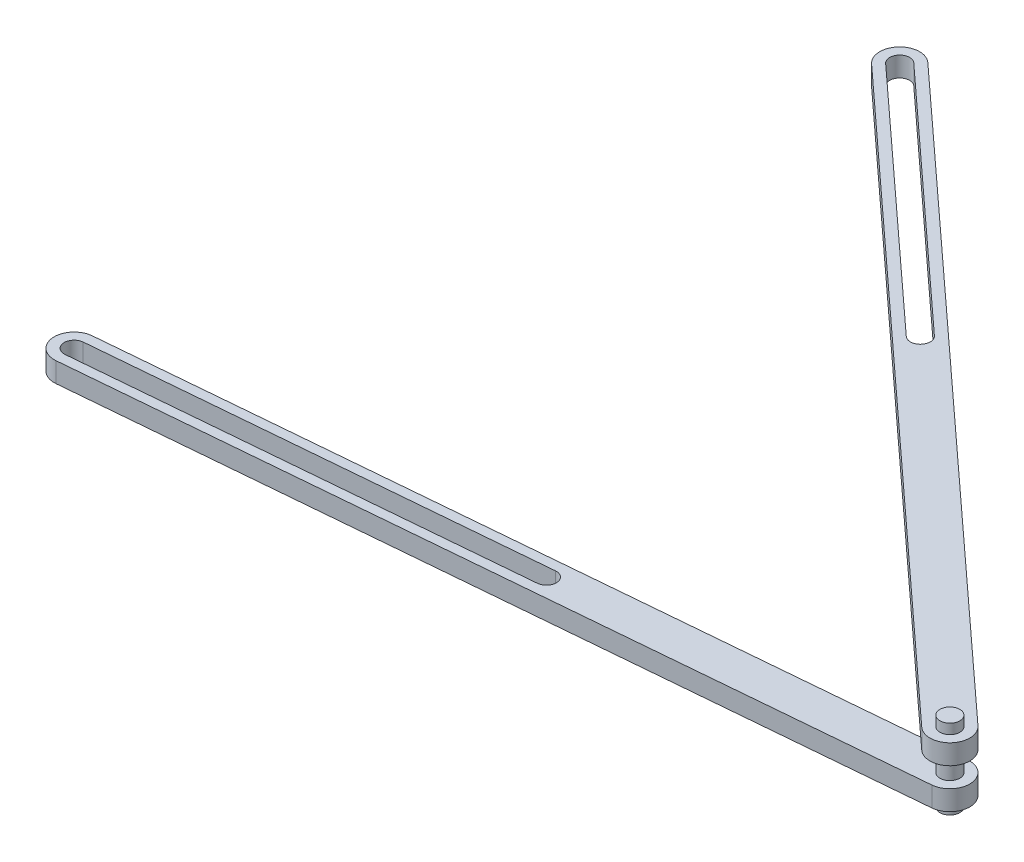
ISO-10303-21;
HEADER;
FILE_DESCRIPTION(('STEP AP214'),'2;1');
FILE_NAME('part.step','',(''),(''),'','','');
FILE_SCHEMA(('AUTOMOTIVE_DESIGN { 1 0 10303 214 1 1 1 1 }'));
ENDSEC;
DATA;
#1=APPLICATION_CONTEXT('core data for automotive mechanical design processes');
#2=APPLICATION_PROTOCOL_DEFINITION('international standard','automotive_design',2000,#1);
#3=PRODUCT_CONTEXT('',#1,'mechanical');
#4=PRODUCT('Part','Part','',(#3));
#5=PRODUCT_RELATED_PRODUCT_CATEGORY('part','',(#4));
#6=PRODUCT_DEFINITION_FORMATION('','',#4);
#7=PRODUCT_DEFINITION_CONTEXT('part definition',#1,'design');
#8=PRODUCT_DEFINITION('design','',#6,#7);
#9=PRODUCT_DEFINITION_SHAPE('','',#8);
#10=(LENGTH_UNIT() NAMED_UNIT(*) SI_UNIT(.MILLI.,.METRE.));
#11=(NAMED_UNIT(*) PLANE_ANGLE_UNIT() SI_UNIT($,.RADIAN.));
#12=(NAMED_UNIT(*) SI_UNIT($,.STERADIAN.) SOLID_ANGLE_UNIT());
#13=UNCERTAINTY_MEASURE_WITH_UNIT(LENGTH_MEASURE(1.E-05),#10,'distance_accuracy_value','');
#14=(GEOMETRIC_REPRESENTATION_CONTEXT(3) GLOBAL_UNCERTAINTY_ASSIGNED_CONTEXT((#13)) GLOBAL_UNIT_ASSIGNED_CONTEXT((#10,
#11,#12)) REPRESENTATION_CONTEXT('',''));
#15=CARTESIAN_POINT('',(0.,0.,0.));
#16=DIRECTION('',(0.,0.,1.));
#17=DIRECTION('',(1.,0.,0.));
#18=AXIS2_PLACEMENT_3D('',#15,#16,#17);
#19=CARTESIAN_POINT('',(-9.06494743049758,-12.,-163.));
#20=DIRECTION('',(0.,1.,0.));
#21=DIRECTION('',(0.,0.,1.));
#22=AXIS2_PLACEMENT_3D('',#19,#20,#21);
#23=PLANE('',#22);
#24=CARTESIAN_POINT('',(-9.06494743049758,-12.,-163.));
#25=DIRECTION('',(0.,1.,0.));
#26=DIRECTION('',(0.,0.,1.));
#27=AXIS2_PLACEMENT_3D('',#24,#25,#26);
#28=CIRCLE('',#27,2.);
#29=CARTESIAN_POINT('',(-9.06494743049758,-12.,-161.));
#30=VERTEX_POINT('',#29);
#31=EDGE_CURVE('E230',#30,#30,#28,.T.);
#32=ORIENTED_EDGE('',*,*,#31,.T.);
#33=EDGE_LOOP('',(#32));
#34=FACE_BOUND('',#33,.T.);
#35=CARTESIAN_POINT('',(-9.06494743049758,-12.,-163.));
#36=DIRECTION('',(0.,-1.,0.));
#37=DIRECTION('',(0.,0.,1.));
#38=AXIS2_PLACEMENT_3D('',#35,#36,#37);
#39=CIRCLE('',#38,3.99999999999999);
#40=CARTESIAN_POINT('',(-9.41357040148823,-12.,-166.984778792367));
#41=VERTEX_POINT('',#40);
#42=CARTESIAN_POINT('',(-8.71632445950694,-12.,-159.015221207633));
#43=VERTEX_POINT('',#42);
#44=EDGE_CURVE('E264',#41,#43,#39,.T.);
#45=ORIENTED_EDGE('',*,*,#44,.T.);
#46=DIRECTION('',(-0.996194698091745,0.,0.0871557427476613));
#47=VECTOR('',#46,1.);
#48=CARTESIAN_POINT('',(-8.71632445950694,-12.,-159.015221207633));
#49=LINE('',#48,#47);
#50=CARTESIAN_POINT('',(-170.599394227623,-12.,-144.852287786146));
#51=VERTEX_POINT('',#50);
#52=EDGE_CURVE('E267',#43,#51,#49,.T.);
#53=ORIENTED_EDGE('',*,*,#52,.T.);
#54=CARTESIAN_POINT('',(-170.948017198614,-12.,-148.837066578513));
#55=DIRECTION('',(0.,-1.,0.));
#56=DIRECTION('',(0.,0.,-1.));
#57=AXIS2_PLACEMENT_3D('',#54,#55,#56);
#58=CIRCLE('',#57,3.99999999999999);
#59=CARTESIAN_POINT('',(-171.296640169604,-12.,-152.82184537088));
#60=VERTEX_POINT('',#59);
#61=EDGE_CURVE('E270',#51,#60,#58,.T.);
#62=ORIENTED_EDGE('',*,*,#61,.T.);
#63=DIRECTION('',(0.996194698091745,0.,-0.0871557427476616));
#64=VECTOR('',#63,1.);
#65=CARTESIAN_POINT('',(-83.9923396413792,-12.,-160.45998194416));
#66=LINE('',#65,#64);
#67=EDGE_CURVE('E272',#60,#41,#66,.T.);
#68=ORIENTED_EDGE('',*,*,#67,.T.);
#69=EDGE_LOOP('',(#45,#53,#62,#68));
#70=FACE_BOUND('',#69,.T.);
#71=CARTESIAN_POINT('',(-83.6437166703885,-12.,-156.475203151793));
#72=DIRECTION('',(0.,-1.,0.));
#73=DIRECTION('',(0.,0.,1.));
#74=AXIS2_PLACEMENT_3D('',#71,#72,#73);
#75=CIRCLE('',#74,2.);
#76=CARTESIAN_POINT('',(-83.8180281558839,-12.,-158.467592547977));
#77=VERTEX_POINT('',#76);
#78=CARTESIAN_POINT('',(-83.4694051848932,-12.,-154.48281375561));
#79=VERTEX_POINT('',#78);
#80=EDGE_CURVE('E238',#77,#79,#75,.T.);
#81=ORIENTED_EDGE('',*,*,#80,.F.);
#82=DIRECTION('',(0.996194698091745,0.,-0.0871557427476616));
#83=VECTOR('',#82,1.);
#84=CARTESIAN_POINT('',(-83.8180281558839,-12.,-158.467592547977));
#85=LINE('',#84,#83);
#86=CARTESIAN_POINT('',(-171.122328684109,-12.,-150.829455974697));
#87=VERTEX_POINT('',#86);
#88=EDGE_CURVE('E245',#87,#77,#85,.T.);
#89=ORIENTED_EDGE('',*,*,#88,.F.);
#90=CARTESIAN_POINT('',(-170.948017198614,-12.,-148.837066578513));
#91=DIRECTION('',(0.,-1.,0.));
#92=DIRECTION('',(0.,0.,-1.));
#93=AXIS2_PLACEMENT_3D('',#90,#91,#92);
#94=CIRCLE('',#93,2.);
#95=CARTESIAN_POINT('',(-170.773705713119,-12.,-146.84467718233));
#96=VERTEX_POINT('',#95);
#97=EDGE_CURVE('E243',#96,#87,#94,.T.);
#98=ORIENTED_EDGE('',*,*,#97,.F.);
#99=DIRECTION('',(-0.996194698091745,0.,0.0871557427476616));
#100=VECTOR('',#99,1.);
#101=CARTESIAN_POINT('',(-83.4694051848932,-12.,-154.48281375561));
#102=LINE('',#101,#100);
#103=EDGE_CURVE('E240',#79,#96,#102,.T.);
#104=ORIENTED_EDGE('',*,*,#103,.F.);
#105=EDGE_LOOP('',(#81,#89,#98,#104));
#106=FACE_BOUND('',#105,.T.);
#107=ADVANCED_FACE('F37',(#34,#70,#106),#23,.F.);
#108=CARTESIAN_POINT('',(-9.06494743049758,-8.,-163.));
#109=DIRECTION('',(0.,1.,0.));
#110=DIRECTION('',(0.,0.,1.));
#111=AXIS2_PLACEMENT_3D('',#108,#109,#110);
#112=PLANE('',#111);
#113=CARTESIAN_POINT('',(-9.06494743049758,-8.,-163.));
#114=DIRECTION('',(0.,1.,0.));
#115=DIRECTION('',(0.,0.,1.));
#116=AXIS2_PLACEMENT_3D('',#113,#114,#115);
#117=CIRCLE('',#116,2.);
#118=CARTESIAN_POINT('',(-9.06494743049758,-8.,-161.));
#119=VERTEX_POINT('',#118);
#120=EDGE_CURVE('E229',#119,#119,#117,.T.);
#121=ORIENTED_EDGE('',*,*,#120,.F.);
#122=EDGE_LOOP('',(#121));
#123=FACE_BOUND('',#122,.T.);
#124=CARTESIAN_POINT('',(-9.06494743049758,-8.,-163.));
#125=DIRECTION('',(0.,-1.,0.));
#126=DIRECTION('',(0.,0.,1.));
#127=AXIS2_PLACEMENT_3D('',#124,#125,#126);
#128=CIRCLE('',#127,3.99999999999999);
#129=CARTESIAN_POINT('',(-9.41357040148823,-8.,-166.984778792367));
#130=VERTEX_POINT('',#129);
#131=CARTESIAN_POINT('',(-8.71632445950694,-8.,-159.015221207633));
#132=VERTEX_POINT('',#131);
#133=EDGE_CURVE('E263',#130,#132,#128,.T.);
#134=ORIENTED_EDGE('',*,*,#133,.F.);
#135=DIRECTION('',(0.996194698091745,0.,-0.0871557427476613));
#136=VECTOR('',#135,1.);
#137=CARTESIAN_POINT('',(-9.41357040148823,-8.,-166.984778792367));
#138=LINE('',#137,#136);
#139=CARTESIAN_POINT('',(-171.296640169604,-8.,-152.82184537088));
#140=VERTEX_POINT('',#139);
#141=EDGE_CURVE('E268',#140,#130,#138,.T.);
#142=ORIENTED_EDGE('',*,*,#141,.F.);
#143=CARTESIAN_POINT('',(-170.948017198614,-8.,-148.837066578513));
#144=DIRECTION('',(0.,-1.,0.));
#145=DIRECTION('',(0.,0.,-1.));
#146=AXIS2_PLACEMENT_3D('',#143,#144,#145);
#147=CIRCLE('',#146,3.99999999999999);
#148=CARTESIAN_POINT('',(-170.599394227623,-8.,-144.852287786146));
#149=VERTEX_POINT('',#148);
#150=EDGE_CURVE('E279',#149,#140,#147,.T.);
#151=ORIENTED_EDGE('',*,*,#150,.F.);
#152=DIRECTION('',(-0.996194698091745,0.,0.0871557427476616));
#153=VECTOR('',#152,1.);
#154=CARTESIAN_POINT('',(-83.2950936993979,-8.,-152.490424359426));
#155=LINE('',#154,#153);
#156=EDGE_CURVE('E277',#132,#149,#155,.T.);
#157=ORIENTED_EDGE('',*,*,#156,.F.);
#158=EDGE_LOOP('',(#134,#142,#151,#157));
#159=FACE_BOUND('',#158,.T.);
#160=DIRECTION('',(0.996194698091745,0.,-0.0871557427476616));
#161=VECTOR('',#160,1.);
#162=CARTESIAN_POINT('',(-83.8180281558839,-8.,-158.467592547977));
#163=LINE('',#162,#161);
#164=CARTESIAN_POINT('',(-171.122328684109,-8.,-150.829455974697));
#165=VERTEX_POINT('',#164);
#166=CARTESIAN_POINT('',(-83.8180281558839,-8.,-158.467592547977));
#167=VERTEX_POINT('',#166);
#168=EDGE_CURVE('E241',#165,#167,#163,.T.);
#169=ORIENTED_EDGE('',*,*,#168,.T.);
#170=CARTESIAN_POINT('',(-83.6437166703885,-8.,-156.475203151793));
#171=DIRECTION('',(0.,-1.,0.));
#172=DIRECTION('',(0.,0.,1.));
#173=AXIS2_PLACEMENT_3D('',#170,#171,#172);
#174=CIRCLE('',#173,2.);
#175=CARTESIAN_POINT('',(-83.4694051848932,-8.,-154.48281375561));
#176=VERTEX_POINT('',#175);
#177=EDGE_CURVE('E60',#167,#176,#174,.T.);
#178=ORIENTED_EDGE('',*,*,#177,.T.);
#179=DIRECTION('',(-0.996194698091745,0.,0.0871557427476616));
#180=VECTOR('',#179,1.);
#181=CARTESIAN_POINT('',(-83.4694051848932,-8.,-154.48281375561));
#182=LINE('',#181,#180);
#183=CARTESIAN_POINT('',(-170.773705713119,-8.,-146.84467718233));
#184=VERTEX_POINT('',#183);
#185=EDGE_CURVE('E249',#176,#184,#182,.T.);
#186=ORIENTED_EDGE('',*,*,#185,.T.);
#187=CARTESIAN_POINT('',(-170.948017198614,-8.,-148.837066578513));
#188=DIRECTION('',(0.,-1.,0.));
#189=DIRECTION('',(0.,0.,-1.));
#190=AXIS2_PLACEMENT_3D('',#187,#188,#189);
#191=CIRCLE('',#190,2.);
#192=EDGE_CURVE('E252',#184,#165,#191,.T.);
#193=ORIENTED_EDGE('',*,*,#192,.T.);
#194=EDGE_LOOP('',(#169,#178,#186,#193));
#195=FACE_BOUND('',#194,.T.);
#196=ADVANCED_FACE('F321',(#123,#159,#195),#112,.T.);
#197=CARTESIAN_POINT('',(-9.06494743049758,-12.,-163.));
#198=DIRECTION('',(0.,1.,0.));
#199=DIRECTION('',(0.,0.,1.));
#200=AXIS2_PLACEMENT_3D('',#197,#198,#199);
#201=CYLINDRICAL_SURFACE('',#200,3.99999999999999);
#202=ORIENTED_EDGE('',*,*,#133,.T.);
#203=DIRECTION('',(0.,1.,0.));
#204=VECTOR('',#203,1.);
#205=CARTESIAN_POINT('',(-8.71632445950694,-12.,-159.015221207633));
#206=LINE('',#205,#204);
#207=EDGE_CURVE('E45',#43,#132,#206,.T.);
#208=ORIENTED_EDGE('',*,*,#207,.F.);
#209=ORIENTED_EDGE('',*,*,#44,.F.);
#210=DIRECTION('',(0.,1.,0.));
#211=VECTOR('',#210,1.);
#212=CARTESIAN_POINT('',(-9.41357040148823,-12.,-166.984778792367));
#213=LINE('',#212,#211);
#214=EDGE_CURVE('E274',#41,#130,#213,.T.);
#215=ORIENTED_EDGE('',*,*,#214,.T.);
#216=EDGE_LOOP('',(#202,#208,#209,#215));
#217=FACE_BOUND('',#216,.T.);
#218=ADVANCED_FACE('F39',(#217),#201,.T.);
#219=CARTESIAN_POINT('',(-83.2950936993979,-12.,-152.490424359426));
#220=DIRECTION('',(-0.0871557427476616,0.,-0.996194698091745));
#221=DIRECTION('',(-0.996194698091745,0.,0.0871557427476616));
#222=AXIS2_PLACEMENT_3D('',#219,#220,#221);
#223=PLANE('',#222);
#224=ORIENTED_EDGE('',*,*,#156,.T.);
#225=DIRECTION('',(0.,1.,0.));
#226=VECTOR('',#225,1.);
#227=CARTESIAN_POINT('',(-170.599394227623,-12.,-144.852287786146));
#228=LINE('',#227,#226);
#229=EDGE_CURVE('E288',#51,#149,#228,.T.);
#230=ORIENTED_EDGE('',*,*,#229,.F.);
#231=ORIENTED_EDGE('',*,*,#52,.F.);
#232=ORIENTED_EDGE('',*,*,#207,.T.);
#233=EDGE_LOOP('',(#224,#230,#231,#232));
#234=FACE_BOUND('',#233,.T.);
#235=ADVANCED_FACE('F340',(#234),#223,.F.);
#236=CARTESIAN_POINT('',(-170.948017198614,-12.,-148.837066578513));
#237=DIRECTION('',(0.,1.,0.));
#238=DIRECTION('',(0.,0.,1.));
#239=AXIS2_PLACEMENT_3D('',#236,#237,#238);
#240=CYLINDRICAL_SURFACE('',#239,3.99999999999999);
#241=ORIENTED_EDGE('',*,*,#150,.T.);
#242=DIRECTION('',(0.,1.,0.));
#243=VECTOR('',#242,1.);
#244=CARTESIAN_POINT('',(-171.296640169604,-12.,-152.82184537088));
#245=LINE('',#244,#243);
#246=EDGE_CURVE('E285',#60,#140,#245,.T.);
#247=ORIENTED_EDGE('',*,*,#246,.F.);
#248=ORIENTED_EDGE('',*,*,#61,.F.);
#249=ORIENTED_EDGE('',*,*,#229,.T.);
#250=EDGE_LOOP('',(#241,#247,#248,#249));
#251=FACE_BOUND('',#250,.T.);
#252=ADVANCED_FACE('F337',(#251),#240,.T.);
#253=CARTESIAN_POINT('',(-9.41357040148823,-12.,-166.984778792367));
#254=DIRECTION('',(0.0871557427476613,0.,0.996194698091745));
#255=DIRECTION('',(0.996194698091745,0.,-0.0871557427476613));
#256=AXIS2_PLACEMENT_3D('',#253,#254,#255);
#257=PLANE('',#256);
#258=ORIENTED_EDGE('',*,*,#141,.T.);
#259=ORIENTED_EDGE('',*,*,#214,.F.);
#260=ORIENTED_EDGE('',*,*,#67,.F.);
#261=ORIENTED_EDGE('',*,*,#246,.T.);
#262=EDGE_LOOP('',(#258,#259,#260,#261));
#263=FACE_BOUND('',#262,.T.);
#264=ADVANCED_FACE('F334',(#263),#257,.F.);
#265=CARTESIAN_POINT('',(-83.6437166703885,-12.,-156.475203151793));
#266=DIRECTION('',(0.,1.,0.));
#267=DIRECTION('',(0.,0.,1.));
#268=AXIS2_PLACEMENT_3D('',#265,#266,#267);
#269=CYLINDRICAL_SURFACE('',#268,2.);
#270=ORIENTED_EDGE('',*,*,#177,.F.);
#271=DIRECTION('',(0.,1.,0.));
#272=VECTOR('',#271,1.);
#273=CARTESIAN_POINT('',(-83.8180281558839,-12.,-158.467592547977));
#274=LINE('',#273,#272);
#275=EDGE_CURVE('E247',#77,#167,#274,.T.);
#276=ORIENTED_EDGE('',*,*,#275,.F.);
#277=ORIENTED_EDGE('',*,*,#80,.T.);
#278=DIRECTION('',(0.,1.,0.));
#279=VECTOR('',#278,1.);
#280=CARTESIAN_POINT('',(-83.4694051848932,-12.,-154.48281375561));
#281=LINE('',#280,#279);
#282=EDGE_CURVE('E261',#79,#176,#281,.T.);
#283=ORIENTED_EDGE('',*,*,#282,.T.);
#284=EDGE_LOOP('',(#270,#276,#277,#283));
#285=FACE_BOUND('',#284,.T.);
#286=ADVANCED_FACE('F331',(#285),#269,.F.);
#287=CARTESIAN_POINT('',(-83.4694051848932,-12.,-154.48281375561));
#288=DIRECTION('',(-0.0871557427476616,0.,-0.996194698091745));
#289=DIRECTION('',(-0.996194698091745,0.,0.0871557427476616));
#290=AXIS2_PLACEMENT_3D('',#287,#288,#289);
#291=PLANE('',#290);
#292=ORIENTED_EDGE('',*,*,#185,.F.);
#293=ORIENTED_EDGE('',*,*,#282,.F.);
#294=ORIENTED_EDGE('',*,*,#103,.T.);
#295=DIRECTION('',(0.,1.,0.));
#296=VECTOR('',#295,1.);
#297=CARTESIAN_POINT('',(-170.773705713119,-12.,-146.84467718233));
#298=LINE('',#297,#296);
#299=EDGE_CURVE('E259',#96,#184,#298,.T.);
#300=ORIENTED_EDGE('',*,*,#299,.T.);
#301=EDGE_LOOP('',(#292,#293,#294,#300));
#302=FACE_BOUND('',#301,.T.);
#303=ADVANCED_FACE('F366',(#302),#291,.T.);
#304=CARTESIAN_POINT('',(-170.948017198614,-12.,-148.837066578513));
#305=DIRECTION('',(0.,1.,0.));
#306=DIRECTION('',(0.,0.,1.));
#307=AXIS2_PLACEMENT_3D('',#304,#305,#306);
#308=CYLINDRICAL_SURFACE('',#307,2.);
#309=ORIENTED_EDGE('',*,*,#192,.F.);
#310=ORIENTED_EDGE('',*,*,#299,.F.);
#311=ORIENTED_EDGE('',*,*,#97,.T.);
#312=DIRECTION('',(0.,1.,0.));
#313=VECTOR('',#312,1.);
#314=CARTESIAN_POINT('',(-171.122328684109,-12.,-150.829455974697));
#315=LINE('',#314,#313);
#316=EDGE_CURVE('E52',#87,#165,#315,.T.);
#317=ORIENTED_EDGE('',*,*,#316,.T.);
#318=EDGE_LOOP('',(#309,#310,#311,#317));
#319=FACE_BOUND('',#318,.T.);
#320=ADVANCED_FACE('F371',(#319),#308,.F.);
#321=CARTESIAN_POINT('',(-83.8180281558839,-12.,-158.467592547977));
#322=DIRECTION('',(0.0871557427476616,0.,0.996194698091745));
#323=DIRECTION('',(0.996194698091745,0.,-0.0871557427476616));
#324=AXIS2_PLACEMENT_3D('',#321,#322,#323);
#325=PLANE('',#324);
#326=ORIENTED_EDGE('',*,*,#168,.F.);
#327=ORIENTED_EDGE('',*,*,#316,.F.);
#328=ORIENTED_EDGE('',*,*,#88,.T.);
#329=ORIENTED_EDGE('',*,*,#275,.T.);
#330=EDGE_LOOP('',(#326,#327,#328,#329));
#331=FACE_BOUND('',#330,.T.);
#332=ADVANCED_FACE('F369',(#331),#325,.T.);
#333=CARTESIAN_POINT('',(-9.06494743049758,2.,-163.));
#334=DIRECTION('',(0.,-1.,0.));
#335=DIRECTION('',(0.,0.,-1.));
#336=AXIS2_PLACEMENT_3D('',#333,#334,#335);
#337=CYLINDRICAL_SURFACE('',#336,2.);
#338=CARTESIAN_POINT('',(-9.06494743049758,-4.,-163.));
#339=DIRECTION('',(0.,-1.,0.));
#340=DIRECTION('',(0.,0.,-1.));
#341=AXIS2_PLACEMENT_3D('',#338,#339,#340);
#342=CIRCLE('',#341,2.);
#343=CARTESIAN_POINT('',(-9.06494743049758,-4.,-165.));
#344=VERTEX_POINT('',#343);
#345=EDGE_CURVE('E225',#344,#344,#342,.T.);
#346=ORIENTED_EDGE('',*,*,#345,.T.);
#347=EDGE_LOOP('',(#346));
#348=FACE_BOUND('',#347,.T.);
#349=ORIENTED_EDGE('',*,*,#120,.T.);
#350=EDGE_LOOP('',(#349));
#351=FACE_BOUND('',#350,.T.);
#352=ADVANCED_FACE('F295',(#348,#351),#337,.T.);
#353=CARTESIAN_POINT('',(-9.06494743049758,-14.,-163.));
#354=DIRECTION('',(0.,1.,0.));
#355=DIRECTION('',(0.,0.,1.));
#356=AXIS2_PLACEMENT_3D('',#353,#354,#355);
#357=CYLINDRICAL_SURFACE('',#356,2.);
#358=CARTESIAN_POINT('',(-9.06494743049758,-14.,-163.));
#359=DIRECTION('',(0.,1.,0.));
#360=DIRECTION('',(0.,0.,1.));
#361=AXIS2_PLACEMENT_3D('',#358,#359,#360);
#362=CIRCLE('',#361,2.);
#363=CARTESIAN_POINT('',(-9.06494743049758,-14.,-161.));
#364=VERTEX_POINT('',#363);
#365=EDGE_CURVE('E226',#364,#364,#362,.T.);
#366=ORIENTED_EDGE('',*,*,#365,.T.);
#367=EDGE_LOOP('',(#366));
#368=FACE_BOUND('',#367,.T.);
#369=ORIENTED_EDGE('',*,*,#31,.F.);
#370=EDGE_LOOP('',(#369));
#371=FACE_BOUND('',#370,.T.);
#372=ADVANCED_FACE('F377',(#368,#371),#357,.T.);
#373=CARTESIAN_POINT('',(-9.06494743049758,-14.,-163.));
#374=DIRECTION('',(0.,1.,0.));
#375=DIRECTION('',(0.,0.,1.));
#376=AXIS2_PLACEMENT_3D('',#373,#374,#375);
#377=PLANE('',#376);
#378=ORIENTED_EDGE('',*,*,#365,.F.);
#379=EDGE_LOOP('',(#378));
#380=FACE_BOUND('',#379,.T.);
#381=ADVANCED_FACE('F525',(#380),#377,.F.);
#382=CARTESIAN_POINT('',(-9.06494743049758,0.,-163.));
#383=DIRECTION('',(0.,-1.,0.));
#384=DIRECTION('',(0.,0.,-1.));
#385=AXIS2_PLACEMENT_3D('',#382,#383,#384);
#386=PLANE('',#385);
#387=CARTESIAN_POINT('',(-9.06494743049758,0.,-163.));
#388=DIRECTION('',(0.,-1.,0.));
#389=DIRECTION('',(0.,0.,-1.));
#390=AXIS2_PLACEMENT_3D('',#387,#388,#389);
#391=CIRCLE('',#390,2.);
#392=CARTESIAN_POINT('',(-9.06494743049758,0.,-165.));
#393=VERTEX_POINT('',#392);
#394=EDGE_CURVE('E11',#393,#393,#391,.T.);
#395=ORIENTED_EDGE('',*,*,#394,.T.);
#396=EDGE_LOOP('',(#395));
#397=FACE_BOUND('',#396,.T.);
#398=CARTESIAN_POINT('',(-9.06494743049758,0.,-163.));
#399=DIRECTION('',(0.,1.,0.));
#400=DIRECTION('',(0.,0.,-1.));
#401=AXIS2_PLACEMENT_3D('',#398,#399,#400);
#402=CIRCLE('',#401,4.);
#403=CARTESIAN_POINT('',(-11.7673082609602,0.,-160.05089065276));
#404=VERTEX_POINT('',#403);
#405=CARTESIAN_POINT('',(-6.36258660003494,0.,-165.94910934724));
#406=VERTEX_POINT('',#405);
#407=EDGE_CURVE('E195',#404,#406,#402,.T.);
#408=ORIENTED_EDGE('',*,*,#407,.T.);
#409=DIRECTION('',(-0.737277336810123,0.,-0.675590207615661));
#410=VECTOR('',#409,1.);
#411=CARTESIAN_POINT('',(-6.36258660003494,0.,-165.94910934724));
#412=LINE('',#411,#410);
#413=CARTESIAN_POINT('',(-126.901571386182,0.,-276.402738791199));
#414=VERTEX_POINT('',#413);
#415=EDGE_CURVE('E198',#406,#414,#412,.T.);
#416=ORIENTED_EDGE('',*,*,#415,.T.);
#417=CARTESIAN_POINT('',(-129.603932216644,0.,-273.453629443958));
#418=DIRECTION('',(0.,1.,0.));
#419=DIRECTION('',(0.,0.,1.));
#420=AXIS2_PLACEMENT_3D('',#417,#418,#419);
#421=CIRCLE('',#420,4.00000000000003);
#422=CARTESIAN_POINT('',(-132.306293047107,0.,-270.504520096718));
#423=VERTEX_POINT('',#422);
#424=EDGE_CURVE('E201',#414,#423,#421,.T.);
#425=ORIENTED_EDGE('',*,*,#424,.T.);
#426=DIRECTION('',(0.737277336810123,0.,0.675590207615661));
#427=VECTOR('',#426,1.);
#428=CARTESIAN_POINT('',(-82.7023608304627,0.,-225.05089065276));
#429=LINE('',#428,#427);
#430=EDGE_CURVE('E203',#423,#404,#429,.T.);
#431=ORIENTED_EDGE('',*,*,#430,.T.);
#432=EDGE_LOOP('',(#408,#416,#425,#431));
#433=FACE_BOUND('',#432,.T.);
#434=CARTESIAN_POINT('',(-80.,0.,-228.));
#435=DIRECTION('',(0.,1.,0.));
#436=DIRECTION('',(0.,0.,-1.));
#437=AXIS2_PLACEMENT_3D('',#434,#435,#436);
#438=CIRCLE('',#437,2.00000000000001);
#439=CARTESIAN_POINT('',(-81.3511804152313,0.,-226.52544532638));
#440=VERTEX_POINT('',#439);
#441=CARTESIAN_POINT('',(-78.6488195847687,0.,-229.47455467362));
#442=VERTEX_POINT('',#441);
#443=EDGE_CURVE('E153',#440,#442,#438,.T.);
#444=ORIENTED_EDGE('',*,*,#443,.F.);
#445=DIRECTION('',(0.737277336810123,0.,0.675590207615662));
#446=VECTOR('',#445,1.);
#447=CARTESIAN_POINT('',(-81.3511804152313,0.,-226.52544532638));
#448=LINE('',#447,#446);
#449=CARTESIAN_POINT('',(-130.955112631876,0.,-271.979074770338));
#450=VERTEX_POINT('',#449);
#451=EDGE_CURVE('E179',#450,#440,#448,.T.);
#452=ORIENTED_EDGE('',*,*,#451,.F.);
#453=CARTESIAN_POINT('',(-129.603932216644,0.,-273.453629443958));
#454=DIRECTION('',(0.,1.,0.));
#455=DIRECTION('',(0.,0.,1.));
#456=AXIS2_PLACEMENT_3D('',#453,#454,#455);
#457=CIRCLE('',#456,1.99999999999999);
#458=CARTESIAN_POINT('',(-128.252751801413,0.,-274.928184117579));
#459=VERTEX_POINT('',#458);
#460=EDGE_CURVE('E177',#459,#450,#457,.T.);
#461=ORIENTED_EDGE('',*,*,#460,.F.);
#462=DIRECTION('',(-0.737277336810123,0.,-0.675590207615661));
#463=VECTOR('',#462,1.);
#464=CARTESIAN_POINT('',(-78.6488195847687,0.,-229.47455467362));
#465=LINE('',#464,#463);
#466=EDGE_CURVE('E163',#442,#459,#465,.T.);
#467=ORIENTED_EDGE('',*,*,#466,.F.);
#468=EDGE_LOOP('',(#444,#452,#461,#467));
#469=FACE_BOUND('',#468,.T.);
#470=ADVANCED_FACE('F175',(#397,#433,#469),#386,.F.);
#471=CARTESIAN_POINT('',(-9.06494743049758,-4.,-163.));
#472=DIRECTION('',(0.,-1.,0.));
#473=DIRECTION('',(0.,0.,-1.));
#474=AXIS2_PLACEMENT_3D('',#471,#472,#473);
#475=PLANE('',#474);
#476=ORIENTED_EDGE('',*,*,#345,.F.);
#477=EDGE_LOOP('',(#476));
#478=FACE_BOUND('',#477,.T.);
#479=CARTESIAN_POINT('',(-9.06494743049758,-4.,-163.));
#480=DIRECTION('',(0.,1.,0.));
#481=DIRECTION('',(0.,0.,-1.));
#482=AXIS2_PLACEMENT_3D('',#479,#480,#481);
#483=CIRCLE('',#482,4.);
#484=CARTESIAN_POINT('',(-11.7673082609602,-4.,-160.05089065276));
#485=VERTEX_POINT('',#484);
#486=CARTESIAN_POINT('',(-6.36258660003494,-4.,-165.94910934724));
#487=VERTEX_POINT('',#486);
#488=EDGE_CURVE('E171',#485,#487,#483,.T.);
#489=ORIENTED_EDGE('',*,*,#488,.F.);
#490=DIRECTION('',(0.737277336810123,0.,0.675590207615661));
#491=VECTOR('',#490,1.);
#492=CARTESIAN_POINT('',(-11.7673082609602,-4.,-160.05089065276));
#493=LINE('',#492,#491);
#494=CARTESIAN_POINT('',(-132.306293047107,-4.,-270.504520096718));
#495=VERTEX_POINT('',#494);
#496=EDGE_CURVE('E199',#495,#485,#493,.T.);
#497=ORIENTED_EDGE('',*,*,#496,.F.);
#498=CARTESIAN_POINT('',(-129.603932216644,-4.,-273.453629443958));
#499=DIRECTION('',(0.,1.,0.));
#500=DIRECTION('',(0.,0.,1.));
#501=AXIS2_PLACEMENT_3D('',#498,#499,#500);
#502=CIRCLE('',#501,4.00000000000003);
#503=CARTESIAN_POINT('',(-126.901571386182,-4.,-276.402738791199));
#504=VERTEX_POINT('',#503);
#505=EDGE_CURVE('E210',#504,#495,#502,.T.);
#506=ORIENTED_EDGE('',*,*,#505,.F.);
#507=DIRECTION('',(-0.737277336810123,0.,-0.675590207615662));
#508=VECTOR('',#507,1.);
#509=CARTESIAN_POINT('',(-77.2976391695374,-4.,-230.949109347241));
#510=LINE('',#509,#508);
#511=EDGE_CURVE('E208',#487,#504,#510,.T.);
#512=ORIENTED_EDGE('',*,*,#511,.F.);
#513=EDGE_LOOP('',(#489,#497,#506,#512));
#514=FACE_BOUND('',#513,.T.);
#515=DIRECTION('',(0.737277336810123,0.,0.675590207615662));
#516=VECTOR('',#515,1.);
#517=CARTESIAN_POINT('',(-81.3511804152313,-4.,-226.52544532638));
#518=LINE('',#517,#516);
#519=CARTESIAN_POINT('',(-130.955112631876,-4.,-271.979074770338));
#520=VERTEX_POINT('',#519);
#521=CARTESIAN_POINT('',(-81.3511804152313,-4.,-226.52544532638));
#522=VERTEX_POINT('',#521);
#523=EDGE_CURVE('E164',#520,#522,#518,.T.);
#524=ORIENTED_EDGE('',*,*,#523,.T.);
#525=CARTESIAN_POINT('',(-80.,-4.,-228.));
#526=DIRECTION('',(0.,1.,0.));
#527=DIRECTION('',(0.,0.,-1.));
#528=AXIS2_PLACEMENT_3D('',#525,#526,#527);
#529=CIRCLE('',#528,2.00000000000001);
#530=CARTESIAN_POINT('',(-78.6488195847687,-4.,-229.47455467362));
#531=VERTEX_POINT('',#530);
#532=EDGE_CURVE('E183',#522,#531,#529,.T.);
#533=ORIENTED_EDGE('',*,*,#532,.T.);
#534=DIRECTION('',(-0.737277336810123,0.,-0.675590207615661));
#535=VECTOR('',#534,1.);
#536=CARTESIAN_POINT('',(-78.6488195847687,-4.,-229.47455467362));
#537=LINE('',#536,#535);
#538=CARTESIAN_POINT('',(-128.252751801413,-4.,-274.928184117579));
#539=VERTEX_POINT('',#538);
#540=EDGE_CURVE('E170',#531,#539,#537,.T.);
#541=ORIENTED_EDGE('',*,*,#540,.T.);
#542=CARTESIAN_POINT('',(-129.603932216644,-4.,-273.453629443958));
#543=DIRECTION('',(0.,1.,0.));
#544=DIRECTION('',(0.,0.,1.));
#545=AXIS2_PLACEMENT_3D('',#542,#543,#544);
#546=CIRCLE('',#545,1.99999999999999);
#547=EDGE_CURVE('E186',#539,#520,#546,.T.);
#548=ORIENTED_EDGE('',*,*,#547,.T.);
#549=EDGE_LOOP('',(#524,#533,#541,#548));
#550=FACE_BOUND('',#549,.T.);
#551=ADVANCED_FACE('F298',(#478,#514,#550),#475,.T.);
#552=CARTESIAN_POINT('',(-9.06494743049758,0.,-163.));
#553=DIRECTION('',(0.,-1.,0.));
#554=DIRECTION('',(0.,0.,-1.));
#555=AXIS2_PLACEMENT_3D('',#552,#553,#554);
#556=CYLINDRICAL_SURFACE('',#555,4.);
#557=ORIENTED_EDGE('',*,*,#488,.T.);
#558=DIRECTION('',(0.,-1.,0.));
#559=VECTOR('',#558,1.);
#560=CARTESIAN_POINT('',(-6.36258660003494,0.,-165.94910934724));
#561=LINE('',#560,#559);
#562=EDGE_CURVE('E222',#406,#487,#561,.T.);
#563=ORIENTED_EDGE('',*,*,#562,.F.);
#564=ORIENTED_EDGE('',*,*,#407,.F.);
#565=DIRECTION('',(0.,-1.,0.));
#566=VECTOR('',#565,1.);
#567=CARTESIAN_POINT('',(-11.7673082609602,0.,-160.05089065276));
#568=LINE('',#567,#566);
#569=EDGE_CURVE('E205',#404,#485,#568,.T.);
#570=ORIENTED_EDGE('',*,*,#569,.T.);
#571=EDGE_LOOP('',(#557,#563,#564,#570));
#572=FACE_BOUND('',#571,.T.);
#573=ADVANCED_FACE('F301',(#572),#556,.T.);
#574=CARTESIAN_POINT('',(-77.2976391695374,0.,-230.949109347241));
#575=DIRECTION('',(-0.675590207615662,0.,0.737277336810123));
#576=DIRECTION('',(0.737277336810123,0.,0.675590207615662));
#577=AXIS2_PLACEMENT_3D('',#574,#575,#576);
#578=PLANE('',#577);
#579=ORIENTED_EDGE('',*,*,#511,.T.);
#580=DIRECTION('',(0.,-1.,0.));
#581=VECTOR('',#580,1.);
#582=CARTESIAN_POINT('',(-126.901571386182,0.,-276.402738791199));
#583=LINE('',#582,#581);
#584=EDGE_CURVE('E219',#414,#504,#583,.T.);
#585=ORIENTED_EDGE('',*,*,#584,.F.);
#586=ORIENTED_EDGE('',*,*,#415,.F.);
#587=ORIENTED_EDGE('',*,*,#562,.T.);
#588=EDGE_LOOP('',(#579,#585,#586,#587));
#589=FACE_BOUND('',#588,.T.);
#590=ADVANCED_FACE('F455',(#589),#578,.F.);
#591=CARTESIAN_POINT('',(-129.603932216644,0.,-273.453629443958));
#592=DIRECTION('',(0.,-1.,0.));
#593=DIRECTION('',(0.,0.,-1.));
#594=AXIS2_PLACEMENT_3D('',#591,#592,#593);
#595=CYLINDRICAL_SURFACE('',#594,4.00000000000003);
#596=ORIENTED_EDGE('',*,*,#505,.T.);
#597=DIRECTION('',(0.,-1.,0.));
#598=VECTOR('',#597,1.);
#599=CARTESIAN_POINT('',(-132.306293047107,0.,-270.504520096718));
#600=LINE('',#599,#598);
#601=EDGE_CURVE('E216',#423,#495,#600,.T.);
#602=ORIENTED_EDGE('',*,*,#601,.F.);
#603=ORIENTED_EDGE('',*,*,#424,.F.);
#604=ORIENTED_EDGE('',*,*,#584,.T.);
#605=EDGE_LOOP('',(#596,#602,#603,#604));
#606=FACE_BOUND('',#605,.T.);
#607=ADVANCED_FACE('F465',(#606),#595,.T.);
#608=CARTESIAN_POINT('',(-11.7673082609602,0.,-160.05089065276));
#609=DIRECTION('',(0.675590207615661,0.,-0.737277336810123));
#610=DIRECTION('',(-0.737277336810123,0.,-0.675590207615661));
#611=AXIS2_PLACEMENT_3D('',#608,#609,#610);
#612=PLANE('',#611);
#613=ORIENTED_EDGE('',*,*,#496,.T.);
#614=ORIENTED_EDGE('',*,*,#569,.F.);
#615=ORIENTED_EDGE('',*,*,#430,.F.);
#616=ORIENTED_EDGE('',*,*,#601,.T.);
#617=EDGE_LOOP('',(#613,#614,#615,#616));
#618=FACE_BOUND('',#617,.T.);
#619=ADVANCED_FACE('F478',(#618),#612,.F.);
#620=CARTESIAN_POINT('',(-80.,0.,-228.));
#621=DIRECTION('',(0.,-1.,0.));
#622=DIRECTION('',(0.,0.,-1.));
#623=AXIS2_PLACEMENT_3D('',#620,#621,#622);
#624=CYLINDRICAL_SURFACE('',#623,2.00000000000001);
#625=ORIENTED_EDGE('',*,*,#532,.F.);
#626=DIRECTION('',(0.,-1.,0.));
#627=VECTOR('',#626,1.);
#628=CARTESIAN_POINT('',(-81.3511804152313,0.,-226.52544532638));
#629=LINE('',#628,#627);
#630=EDGE_CURVE('E159',#440,#522,#629,.T.);
#631=ORIENTED_EDGE('',*,*,#630,.F.);
#632=ORIENTED_EDGE('',*,*,#443,.T.);
#633=DIRECTION('',(0.,-1.,0.));
#634=VECTOR('',#633,1.);
#635=CARTESIAN_POINT('',(-78.6488195847687,0.,-229.47455467362));
#636=LINE('',#635,#634);
#637=EDGE_CURVE('E156',#442,#531,#636,.T.);
#638=ORIENTED_EDGE('',*,*,#637,.T.);
#639=EDGE_LOOP('',(#625,#631,#632,#638));
#640=FACE_BOUND('',#639,.T.);
#641=ADVANCED_FACE('F155',(#640),#624,.F.);
#642=CARTESIAN_POINT('',(-78.6488195847687,0.,-229.47455467362));
#643=DIRECTION('',(-0.675590207615661,0.,0.737277336810123));
#644=DIRECTION('',(0.737277336810123,0.,0.675590207615661));
#645=AXIS2_PLACEMENT_3D('',#642,#643,#644);
#646=PLANE('',#645);
#647=ORIENTED_EDGE('',*,*,#540,.F.);
#648=ORIENTED_EDGE('',*,*,#637,.F.);
#649=ORIENTED_EDGE('',*,*,#466,.T.);
#650=DIRECTION('',(0.,-1.,0.));
#651=VECTOR('',#650,1.);
#652=CARTESIAN_POINT('',(-128.252751801413,0.,-274.928184117579));
#653=LINE('',#652,#651);
#654=EDGE_CURVE('E172',#459,#539,#653,.T.);
#655=ORIENTED_EDGE('',*,*,#654,.T.);
#656=EDGE_LOOP('',(#647,#648,#649,#655));
#657=FACE_BOUND('',#656,.T.);
#658=ADVANCED_FACE('F167',(#657),#646,.T.);
#659=CARTESIAN_POINT('',(-129.603932216644,0.,-273.453629443958));
#660=DIRECTION('',(0.,-1.,0.));
#661=DIRECTION('',(0.,0.,-1.));
#662=AXIS2_PLACEMENT_3D('',#659,#660,#661);
#663=CYLINDRICAL_SURFACE('',#662,1.99999999999999);
#664=ORIENTED_EDGE('',*,*,#547,.F.);
#665=ORIENTED_EDGE('',*,*,#654,.F.);
#666=ORIENTED_EDGE('',*,*,#460,.T.);
#667=DIRECTION('',(0.,-1.,0.));
#668=VECTOR('',#667,1.);
#669=CARTESIAN_POINT('',(-130.955112631876,0.,-271.979074770338));
#670=LINE('',#669,#668);
#671=EDGE_CURVE('E192',#450,#520,#670,.T.);
#672=ORIENTED_EDGE('',*,*,#671,.T.);
#673=EDGE_LOOP('',(#664,#665,#666,#672));
#674=FACE_BOUND('',#673,.T.);
#675=ADVANCED_FACE('F310',(#674),#663,.F.);
#676=CARTESIAN_POINT('',(-81.3511804152313,0.,-226.52544532638));
#677=DIRECTION('',(0.675590207615662,0.,-0.737277336810123));
#678=DIRECTION('',(-0.737277336810123,0.,-0.675590207615662));
#679=AXIS2_PLACEMENT_3D('',#676,#677,#678);
#680=PLANE('',#679);
#681=ORIENTED_EDGE('',*,*,#523,.F.);
#682=ORIENTED_EDGE('',*,*,#671,.F.);
#683=ORIENTED_EDGE('',*,*,#451,.T.);
#684=ORIENTED_EDGE('',*,*,#630,.T.);
#685=EDGE_LOOP('',(#681,#682,#683,#684));
#686=FACE_BOUND('',#685,.T.);
#687=ADVANCED_FACE('F308',(#686),#680,.T.);
#688=CARTESIAN_POINT('',(-9.06494743049758,2.,-163.));
#689=DIRECTION('',(0.,1.,0.));
#690=DIRECTION('',(0.,0.,1.));
#691=AXIS2_PLACEMENT_3D('',#688,#689,#690);
#692=PLANE('',#691);
#693=CARTESIAN_POINT('',(-9.06494743049758,2.,-163.));
#694=DIRECTION('',(0.,1.,0.));
#695=DIRECTION('',(0.,0.,1.));
#696=AXIS2_PLACEMENT_3D('',#693,#694,#695);
#697=CIRCLE('',#696,2.);
#698=CARTESIAN_POINT('',(-9.06494743049758,2.,-161.));
#699=VERTEX_POINT('',#698);
#700=EDGE_CURVE('E233',#699,#699,#697,.T.);
#701=ORIENTED_EDGE('',*,*,#700,.T.);
#702=EDGE_LOOP('',(#701));
#703=FACE_BOUND('',#702,.T.);
#704=ADVANCED_FACE('F317',(#703),#692,.T.);
#705=ORIENTED_EDGE('',*,*,#700,.F.);
#706=EDGE_LOOP('',(#705));
#707=FACE_BOUND('',#706,.T.);
#708=ORIENTED_EDGE('',*,*,#394,.F.);
#709=EDGE_LOOP('',(#708));
#710=FACE_BOUND('',#709,.T.);
#711=ADVANCED_FACE('F379',(#707,#710),#337,.T.);
#712=CLOSED_SHELL('',(#107,#196,#218,#235,#252,#264,#286,#303,#320,#332,#352,#372,#381,#470,
#551,#573,#590,#607,#619,#641,#658,#675,#687,#704,#711));
#713=MANIFOLD_SOLID_BREP('B2',#712);
#714=ADVANCED_BREP_SHAPE_REPRESENTATION('',(#18,#713),#14);
#715=SHAPE_DEFINITION_REPRESENTATION(#9,#714);
ENDSEC;
END-ISO-10303-21;
